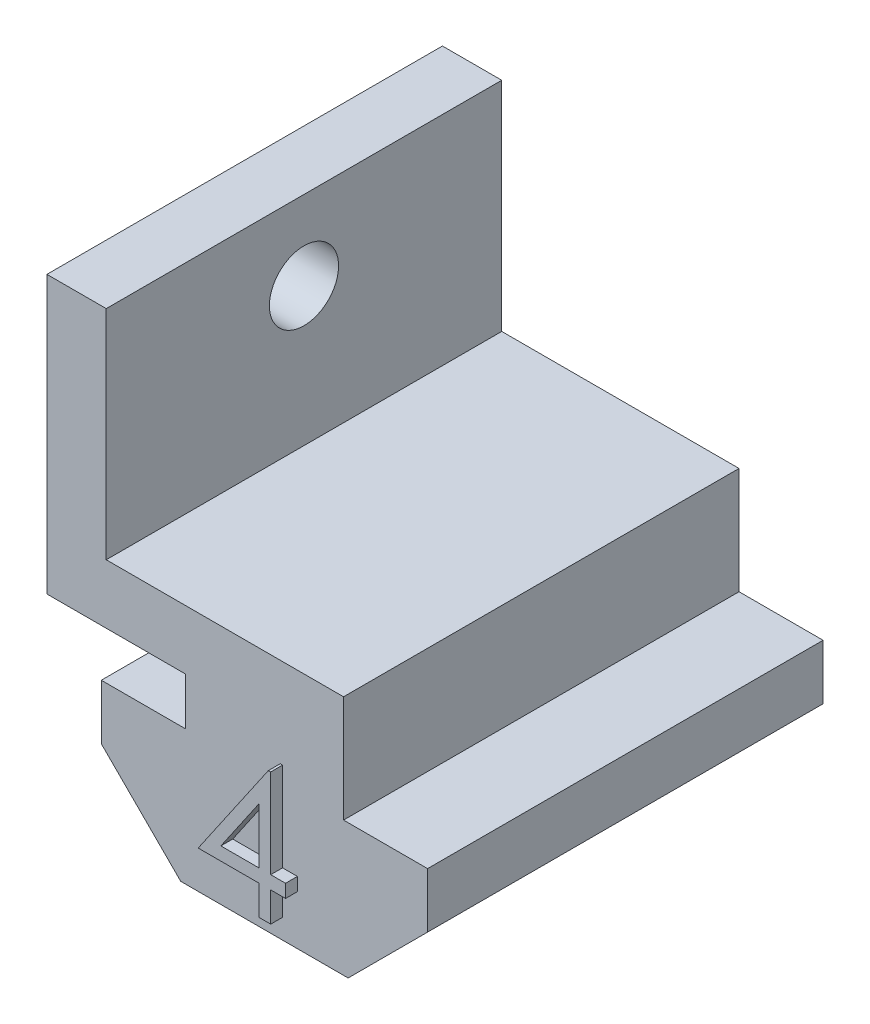
ISO-10303-21;
HEADER;
FILE_DESCRIPTION(('STEP AP214'),'2;1');
FILE_NAME('part.step','',(''),(''),'','','');
FILE_SCHEMA(('AUTOMOTIVE_DESIGN { 1 0 10303 214 1 1 1 1 }'));
ENDSEC;
DATA;
#1=APPLICATION_CONTEXT('core data for automotive mechanical design processes');
#2=APPLICATION_PROTOCOL_DEFINITION('international standard','automotive_design',2000,#1);
#3=PRODUCT_CONTEXT('',#1,'mechanical');
#4=PRODUCT('Part','Part','',(#3));
#5=PRODUCT_RELATED_PRODUCT_CATEGORY('part','',(#4));
#6=PRODUCT_DEFINITION_FORMATION('','',#4);
#7=PRODUCT_DEFINITION_CONTEXT('part definition',#1,'design');
#8=PRODUCT_DEFINITION('design','',#6,#7);
#9=PRODUCT_DEFINITION_SHAPE('','',#8);
#10=(LENGTH_UNIT() NAMED_UNIT(*) SI_UNIT(.MILLI.,.METRE.));
#11=(NAMED_UNIT(*) PLANE_ANGLE_UNIT() SI_UNIT($,.RADIAN.));
#12=(NAMED_UNIT(*) SI_UNIT($,.STERADIAN.) SOLID_ANGLE_UNIT());
#13=UNCERTAINTY_MEASURE_WITH_UNIT(LENGTH_MEASURE(1.E-05),#10,'distance_accuracy_value','');
#14=(GEOMETRIC_REPRESENTATION_CONTEXT(3) GLOBAL_UNCERTAINTY_ASSIGNED_CONTEXT((#13)) GLOBAL_UNIT_ASSIGNED_CONTEXT((#10,
#11,#12)) REPRESENTATION_CONTEXT('',''));
#15=CARTESIAN_POINT('',(0.,0.,0.));
#16=DIRECTION('',(0.,0.,1.));
#17=DIRECTION('',(1.,0.,0.));
#18=AXIS2_PLACEMENT_3D('',#15,#16,#17);
#19=CARTESIAN_POINT('',(0.,0.,0.));
#20=DIRECTION('',(0.,0.,-1.));
#21=DIRECTION('',(-1.,0.,0.));
#22=AXIS2_PLACEMENT_3D('',#19,#20,#21);
#23=PLANE('',#22);
#24=DIRECTION('',(-1.,0.,0.));
#25=VECTOR('',#24,1.);
#26=CARTESIAN_POINT('',(0.333333333333333,2.5,0.));
#27=LINE('',#26,#25);
#28=CARTESIAN_POINT('',(0.333333333333333,2.5,0.));
#29=VERTEX_POINT('',#28);
#30=CARTESIAN_POINT('',(-2.75,2.5,0.));
#31=VERTEX_POINT('',#30);
#32=EDGE_CURVE('E249',#29,#31,#27,.T.);
#33=ORIENTED_EDGE('',*,*,#32,.T.);
#34=DIRECTION('',(0.566105543193208,0.824332768950697,0.));
#35=VECTOR('',#34,1.);
#36=CARTESIAN_POINT('',(-2.75,2.5,0.));
#37=LINE('',#36,#35);
#38=CARTESIAN_POINT('',(0.798177083333333,7.66666666666667,0.));
#39=VERTEX_POINT('',#38);
#40=EDGE_CURVE('E230',#31,#39,#37,.T.);
#41=ORIENTED_EDGE('',*,*,#40,.T.);
#42=DIRECTION('',(1.,0.,0.));
#43=VECTOR('',#42,1.);
#44=CARTESIAN_POINT('',(0.798177083333333,7.66666666666667,0.));
#45=LINE('',#44,#43);
#46=CARTESIAN_POINT('',(0.916666666666666,7.66666666666667,0.));
#47=VERTEX_POINT('',#46);
#48=EDGE_CURVE('E279',#39,#47,#45,.T.);
#49=ORIENTED_EDGE('',*,*,#48,.T.);
#50=DIRECTION('',(0.,-1.,0.));
#51=VECTOR('',#50,1.);
#52=CARTESIAN_POINT('',(0.916666666666666,7.66666666666667,0.));
#53=LINE('',#52,#51);
#54=CARTESIAN_POINT('',(0.916666666666666,3.16666666666667,0.));
#55=VERTEX_POINT('',#54);
#56=EDGE_CURVE('E50',#47,#55,#53,.T.);
#57=ORIENTED_EDGE('',*,*,#56,.T.);
#58=DIRECTION('',(1.,0.,0.));
#59=VECTOR('',#58,1.);
#60=CARTESIAN_POINT('',(0.916666666666666,3.16666666666667,0.));
#61=LINE('',#60,#59);
#62=CARTESIAN_POINT('',(1.66666666666667,3.16666666666667,0.));
#63=VERTEX_POINT('',#62);
#64=EDGE_CURVE('E283',#55,#63,#61,.T.);
#65=ORIENTED_EDGE('',*,*,#64,.T.);
#66=DIRECTION('',(0.,-1.,0.));
#67=VECTOR('',#66,1.);
#68=CARTESIAN_POINT('',(1.66666666666667,3.16666666666667,0.));
#69=LINE('',#68,#67);
#70=CARTESIAN_POINT('',(1.66666666666667,2.5,0.));
#71=VERTEX_POINT('',#70);
#72=EDGE_CURVE('E286',#63,#71,#69,.T.);
#73=ORIENTED_EDGE('',*,*,#72,.T.);
#74=DIRECTION('',(-1.,0.,0.));
#75=VECTOR('',#74,1.);
#76=CARTESIAN_POINT('',(1.66666666666667,2.5,0.));
#77=LINE('',#76,#75);
#78=CARTESIAN_POINT('',(0.916666666666666,2.5,0.));
#79=VERTEX_POINT('',#78);
#80=EDGE_CURVE('E289',#71,#79,#77,.T.);
#81=ORIENTED_EDGE('',*,*,#80,.T.);
#82=DIRECTION('',(0.,-1.,0.));
#83=VECTOR('',#82,1.);
#84=CARTESIAN_POINT('',(0.916666666666666,2.5,0.));
#85=LINE('',#84,#83);
#86=CARTESIAN_POINT('',(0.916666666666666,1.,0.));
#87=VERTEX_POINT('',#86);
#88=EDGE_CURVE('E292',#79,#87,#85,.T.);
#89=ORIENTED_EDGE('',*,*,#88,.T.);
#90=DIRECTION('',(-1.,0.,0.));
#91=VECTOR('',#90,1.);
#92=CARTESIAN_POINT('',(0.916666666666666,1.,0.));
#93=LINE('',#92,#91);
#94=CARTESIAN_POINT('',(0.333333333333333,1.,0.));
#95=VERTEX_POINT('',#94);
#96=EDGE_CURVE('E295',#87,#95,#93,.T.);
#97=ORIENTED_EDGE('',*,*,#96,.T.);
#98=DIRECTION('',(0.,1.,0.));
#99=VECTOR('',#98,1.);
#100=CARTESIAN_POINT('',(0.333333333333333,1.,0.));
#101=LINE('',#100,#99);
#102=EDGE_CURVE('E298',#95,#29,#101,.T.);
#103=ORIENTED_EDGE('',*,*,#102,.T.);
#104=EDGE_LOOP('',(#33,#41,#49,#57,#65,#73,#81,#89,#97,#103));
#105=FACE_BOUND('',#104,.T.);
#106=DIRECTION('',(-1.,0.,0.));
#107=VECTOR('',#106,1.);
#108=CARTESIAN_POINT('',(-8.,12.2,0.));
#109=LINE('',#108,#107);
#110=CARTESIAN_POINT('',(4.00000000000456,12.2,0.));
#111=VERTEX_POINT('',#110);
#112=CARTESIAN_POINT('',(-8.,12.2,0.));
#113=VERTEX_POINT('',#112);
#114=EDGE_CURVE('E326',#111,#113,#109,.T.);
#115=ORIENTED_EDGE('',*,*,#114,.T.);
#116=DIRECTION('',(0.,1.,0.));
#117=VECTOR('',#116,1.);
#118=CARTESIAN_POINT('',(-8.,23.2,0.));
#119=LINE('',#118,#117);
#120=CARTESIAN_POINT('',(-8.,23.2,0.));
#121=VERTEX_POINT('',#120);
#122=EDGE_CURVE('E373',#113,#121,#119,.T.);
#123=ORIENTED_EDGE('',*,*,#122,.T.);
#124=DIRECTION('',(-1.,0.,0.));
#125=VECTOR('',#124,1.);
#126=CARTESIAN_POINT('',(-11.,23.2,0.));
#127=LINE('',#126,#125);
#128=CARTESIAN_POINT('',(-11.,23.2,0.));
#129=VERTEX_POINT('',#128);
#130=EDGE_CURVE('E376',#121,#129,#127,.T.);
#131=ORIENTED_EDGE('',*,*,#130,.T.);
#132=DIRECTION('',(0.,-1.,0.));
#133=VECTOR('',#132,1.);
#134=CARTESIAN_POINT('',(-11.,9.2,0.));
#135=LINE('',#134,#133);
#136=CARTESIAN_POINT('',(-11.,9.2,0.));
#137=VERTEX_POINT('',#136);
#138=EDGE_CURVE('E379',#129,#137,#135,.T.);
#139=ORIENTED_EDGE('',*,*,#138,.T.);
#140=DIRECTION('',(1.,0.,0.));
#141=VECTOR('',#140,1.);
#142=CARTESIAN_POINT('',(-4.00000000000456,9.2,0.));
#143=LINE('',#142,#141);
#144=CARTESIAN_POINT('',(-4.00000000000456,9.2,0.));
#145=VERTEX_POINT('',#144);
#146=EDGE_CURVE('E382',#137,#145,#143,.T.);
#147=ORIENTED_EDGE('',*,*,#146,.T.);
#148=DIRECTION('',(0.,-1.,0.));
#149=VECTOR('',#148,1.);
#150=CARTESIAN_POINT('',(-4.00000000000456,9.2,0.));
#151=LINE('',#150,#149);
#152=CARTESIAN_POINT('',(-4.00000000000454,6.8,0.));
#153=VERTEX_POINT('',#152);
#154=EDGE_CURVE('E385',#145,#153,#151,.T.);
#155=ORIENTED_EDGE('',*,*,#154,.T.);
#156=DIRECTION('',(-1.,0.,0.));
#157=VECTOR('',#156,1.);
#158=CARTESIAN_POINT('',(-4.00000000000454,6.8,0.));
#159=LINE('',#158,#157);
#160=CARTESIAN_POINT('',(-8.25000000000231,6.8,0.));
#161=VERTEX_POINT('',#160);
#162=EDGE_CURVE('E388',#153,#161,#159,.T.);
#163=ORIENTED_EDGE('',*,*,#162,.T.);
#164=DIRECTION('',(0.,-1.,0.));
#165=VECTOR('',#164,1.);
#166=CARTESIAN_POINT('',(-8.25000000000231,6.8,0.));
#167=LINE('',#166,#165);
#168=CARTESIAN_POINT('',(-8.25000000000227,4.01776695296648,0.));
#169=VERTEX_POINT('',#168);
#170=EDGE_CURVE('E391',#161,#169,#167,.T.);
#171=ORIENTED_EDGE('',*,*,#170,.T.);
#172=DIRECTION('',(0.707106781186544,-0.707106781186551,0.));
#173=VECTOR('',#172,1.);
#174=CARTESIAN_POINT('',(-8.25000000000227,4.01776695296648,0.));
#175=LINE('',#174,#173);
#176=CARTESIAN_POINT('',(-4.23223304703582,0.,0.));
#177=VERTEX_POINT('',#176);
#178=EDGE_CURVE('E394',#169,#177,#175,.T.);
#179=ORIENTED_EDGE('',*,*,#178,.T.);
#180=DIRECTION('',(1.,0.,0.));
#181=VECTOR('',#180,1.);
#182=CARTESIAN_POINT('',(-4.23223304703582,0.,0.));
#183=LINE('',#182,#181);
#184=CARTESIAN_POINT('',(4.23223304703582,0.,0.));
#185=VERTEX_POINT('',#184);
#186=EDGE_CURVE('E397',#177,#185,#183,.T.);
#187=ORIENTED_EDGE('',*,*,#186,.T.);
#188=DIRECTION('',(0.707106781186548,0.707106781186548,0.));
#189=VECTOR('',#188,1.);
#190=CARTESIAN_POINT('',(8.25000000000231,4.01776695296648,0.));
#191=LINE('',#190,#189);
#192=CARTESIAN_POINT('',(8.25000000000231,4.01776695296648,0.));
#193=VERTEX_POINT('',#192);
#194=EDGE_CURVE('E400',#185,#193,#191,.T.);
#195=ORIENTED_EDGE('',*,*,#194,.T.);
#196=DIRECTION('',(0.,1.,0.));
#197=VECTOR('',#196,1.);
#198=CARTESIAN_POINT('',(8.25000000000231,6.8,0.));
#199=LINE('',#198,#197);
#200=CARTESIAN_POINT('',(8.25000000000231,6.8,0.));
#201=VERTEX_POINT('',#200);
#202=EDGE_CURVE('E403',#193,#201,#199,.T.);
#203=ORIENTED_EDGE('',*,*,#202,.T.);
#204=DIRECTION('',(-1.,0.,0.));
#205=VECTOR('',#204,1.);
#206=CARTESIAN_POINT('',(4.00000000000461,6.8,0.));
#207=LINE('',#206,#205);
#208=CARTESIAN_POINT('',(4.00000000000461,6.8,0.));
#209=VERTEX_POINT('',#208);
#210=EDGE_CURVE('E406',#201,#209,#207,.T.);
#211=ORIENTED_EDGE('',*,*,#210,.T.);
#212=DIRECTION('',(0.,1.,0.));
#213=VECTOR('',#212,1.);
#214=CARTESIAN_POINT('',(4.00000000000456,12.2,0.));
#215=LINE('',#214,#213);
#216=EDGE_CURVE('E333',#209,#111,#215,.T.);
#217=ORIENTED_EDGE('',*,*,#216,.T.);
#218=EDGE_LOOP('',(#115,#123,#131,#139,#147,#155,#163,#171,#179,#187,#195,#203,#211,#217));
#219=FACE_BOUND('',#218,.T.);
#220=ADVANCED_FACE('F33',(#105,#219),#23,.F.);
#221=CARTESIAN_POINT('',(-8.,12.2,-20.));
#222=DIRECTION('',(0.,1.,0.));
#223=DIRECTION('',(0.,0.,1.));
#224=AXIS2_PLACEMENT_3D('',#221,#222,#223);
#225=PLANE('',#224);
#226=ORIENTED_EDGE('',*,*,#114,.F.);
#227=DIRECTION('',(0.,0.,1.));
#228=VECTOR('',#227,1.);
#229=CARTESIAN_POINT('',(4.00000000000456,12.2,-20.));
#230=LINE('',#229,#228);
#231=CARTESIAN_POINT('',(4.00000000000456,12.2,-20.));
#232=VERTEX_POINT('',#231);
#233=EDGE_CURVE('E11',#232,#111,#230,.T.);
#234=ORIENTED_EDGE('',*,*,#233,.F.);
#235=DIRECTION('',(-1.,0.,0.));
#236=VECTOR('',#235,1.);
#237=CARTESIAN_POINT('',(-8.,12.2,-20.));
#238=LINE('',#237,#236);
#239=CARTESIAN_POINT('',(-8.,12.2,-20.));
#240=VERTEX_POINT('',#239);
#241=EDGE_CURVE('E329',#232,#240,#238,.T.);
#242=ORIENTED_EDGE('',*,*,#241,.T.);
#243=DIRECTION('',(0.,0.,1.));
#244=VECTOR('',#243,1.);
#245=CARTESIAN_POINT('',(-8.,12.2,-20.));
#246=LINE('',#245,#244);
#247=EDGE_CURVE('E37',#240,#113,#246,.T.);
#248=ORIENTED_EDGE('',*,*,#247,.T.);
#249=EDGE_LOOP('',(#226,#234,#242,#248));
#250=FACE_BOUND('',#249,.T.);
#251=ADVANCED_FACE('F35',(#250),#225,.T.);
#252=CARTESIAN_POINT('',(4.00000000000456,12.2,-20.));
#253=DIRECTION('',(1.,0.,0.));
#254=DIRECTION('',(0.,1.,0.));
#255=AXIS2_PLACEMENT_3D('',#252,#253,#254);
#256=PLANE('',#255);
#257=ORIENTED_EDGE('',*,*,#216,.F.);
#258=DIRECTION('',(0.,0.,1.));
#259=VECTOR('',#258,1.);
#260=CARTESIAN_POINT('',(4.00000000000461,6.8,-20.));
#261=LINE('',#260,#259);
#262=CARTESIAN_POINT('',(4.00000000000461,6.8,-20.));
#263=VERTEX_POINT('',#262);
#264=EDGE_CURVE('E42',#263,#209,#261,.T.);
#265=ORIENTED_EDGE('',*,*,#264,.F.);
#266=DIRECTION('',(0.,1.,0.));
#267=VECTOR('',#266,1.);
#268=CARTESIAN_POINT('',(4.00000000000456,9.2,-20.));
#269=LINE('',#268,#267);
#270=EDGE_CURVE('E369',#263,#232,#269,.T.);
#271=ORIENTED_EDGE('',*,*,#270,.T.);
#272=ORIENTED_EDGE('',*,*,#233,.T.);
#273=EDGE_LOOP('',(#257,#265,#271,#272));
#274=FACE_BOUND('',#273,.T.);
#275=ADVANCED_FACE('F445',(#274),#256,.T.);
#276=CARTESIAN_POINT('',(4.00000000000461,6.8,-20.));
#277=DIRECTION('',(0.,1.,0.));
#278=DIRECTION('',(0.,0.,1.));
#279=AXIS2_PLACEMENT_3D('',#276,#277,#278);
#280=PLANE('',#279);
#281=ORIENTED_EDGE('',*,*,#210,.F.);
#282=DIRECTION('',(0.,0.,1.));
#283=VECTOR('',#282,1.);
#284=CARTESIAN_POINT('',(8.25000000000231,6.8,-20.));
#285=LINE('',#284,#283);
#286=CARTESIAN_POINT('',(8.25000000000231,6.8,-20.));
#287=VERTEX_POINT('',#286);
#288=EDGE_CURVE('E413',#287,#201,#285,.T.);
#289=ORIENTED_EDGE('',*,*,#288,.F.);
#290=DIRECTION('',(-1.,0.,0.));
#291=VECTOR('',#290,1.);
#292=CARTESIAN_POINT('',(4.00000000000461,6.8,-20.));
#293=LINE('',#292,#291);
#294=EDGE_CURVE('E366',#287,#263,#293,.T.);
#295=ORIENTED_EDGE('',*,*,#294,.T.);
#296=ORIENTED_EDGE('',*,*,#264,.T.);
#297=EDGE_LOOP('',(#281,#289,#295,#296));
#298=FACE_BOUND('',#297,.T.);
#299=ADVANCED_FACE('F448',(#298),#280,.T.);
#300=CARTESIAN_POINT('',(8.25000000000231,6.8,-20.));
#301=DIRECTION('',(1.,0.,0.));
#302=DIRECTION('',(0.,0.,-1.));
#303=AXIS2_PLACEMENT_3D('',#300,#301,#302);
#304=PLANE('',#303);
#305=ORIENTED_EDGE('',*,*,#202,.F.);
#306=DIRECTION('',(0.,0.,1.));
#307=VECTOR('',#306,1.);
#308=CARTESIAN_POINT('',(8.25000000000231,4.01776695296648,-20.));
#309=LINE('',#308,#307);
#310=CARTESIAN_POINT('',(8.25000000000231,4.01776695296648,-20.));
#311=VERTEX_POINT('',#310);
#312=EDGE_CURVE('E415',#311,#193,#309,.T.);
#313=ORIENTED_EDGE('',*,*,#312,.F.);
#314=DIRECTION('',(0.,1.,0.));
#315=VECTOR('',#314,1.);
#316=CARTESIAN_POINT('',(8.25000000000231,6.8,-20.));
#317=LINE('',#316,#315);
#318=EDGE_CURVE('E363',#311,#287,#317,.T.);
#319=ORIENTED_EDGE('',*,*,#318,.T.);
#320=ORIENTED_EDGE('',*,*,#288,.T.);
#321=EDGE_LOOP('',(#305,#313,#319,#320));
#322=FACE_BOUND('',#321,.T.);
#323=ADVANCED_FACE('F456',(#322),#304,.T.);
#324=CARTESIAN_POINT('',(8.25000000000231,4.01776695296648,-20.));
#325=DIRECTION('',(0.707106781186548,-0.707106781186548,0.));
#326=DIRECTION('',(0.707106781186548,0.707106781186548,0.));
#327=AXIS2_PLACEMENT_3D('',#324,#325,#326);
#328=PLANE('',#327);
#329=ORIENTED_EDGE('',*,*,#194,.F.);
#330=DIRECTION('',(0.,0.,1.));
#331=VECTOR('',#330,1.);
#332=CARTESIAN_POINT('',(4.23223304703582,0.,-20.));
#333=LINE('',#332,#331);
#334=CARTESIAN_POINT('',(4.23223304703582,0.,-20.));
#335=VERTEX_POINT('',#334);
#336=EDGE_CURVE('E417',#335,#185,#333,.T.);
#337=ORIENTED_EDGE('',*,*,#336,.F.);
#338=DIRECTION('',(0.707106781186548,0.707106781186548,0.));
#339=VECTOR('',#338,1.);
#340=CARTESIAN_POINT('',(8.25000000000231,4.01776695296648,-20.));
#341=LINE('',#340,#339);
#342=EDGE_CURVE('E360',#335,#311,#341,.T.);
#343=ORIENTED_EDGE('',*,*,#342,.T.);
#344=ORIENTED_EDGE('',*,*,#312,.T.);
#345=EDGE_LOOP('',(#329,#337,#343,#344));
#346=FACE_BOUND('',#345,.T.);
#347=ADVANCED_FACE('F459',(#346),#328,.T.);
#348=CARTESIAN_POINT('',(-4.23223304703582,0.,-20.));
#349=DIRECTION('',(0.,-1.,0.));
#350=DIRECTION('',(1.,0.,0.));
#351=AXIS2_PLACEMENT_3D('',#348,#349,#350);
#352=PLANE('',#351);
#353=ORIENTED_EDGE('',*,*,#186,.F.);
#354=DIRECTION('',(0.,0.,1.));
#355=VECTOR('',#354,1.);
#356=CARTESIAN_POINT('',(-4.23223304703582,0.,-20.));
#357=LINE('',#356,#355);
#358=CARTESIAN_POINT('',(-4.23223304703582,0.,-20.));
#359=VERTEX_POINT('',#358);
#360=EDGE_CURVE('E419',#359,#177,#357,.T.);
#361=ORIENTED_EDGE('',*,*,#360,.F.);
#362=DIRECTION('',(1.,0.,0.));
#363=VECTOR('',#362,1.);
#364=CARTESIAN_POINT('',(-4.23223304703582,0.,-20.));
#365=LINE('',#364,#363);
#366=EDGE_CURVE('E357',#359,#335,#365,.T.);
#367=ORIENTED_EDGE('',*,*,#366,.T.);
#368=ORIENTED_EDGE('',*,*,#336,.T.);
#369=EDGE_LOOP('',(#353,#361,#367,#368));
#370=FACE_BOUND('',#369,.T.);
#371=ADVANCED_FACE('F464',(#370),#352,.T.);
#372=CARTESIAN_POINT('',(-8.25000000000227,4.01776695296648,-20.));
#373=DIRECTION('',(-0.707106781186551,-0.707106781186544,0.));
#374=DIRECTION('',(0.707106781186544,-0.707106781186551,0.));
#375=AXIS2_PLACEMENT_3D('',#372,#373,#374);
#376=PLANE('',#375);
#377=ORIENTED_EDGE('',*,*,#178,.F.);
#378=DIRECTION('',(0.,0.,1.));
#379=VECTOR('',#378,1.);
#380=CARTESIAN_POINT('',(-8.25000000000227,4.01776695296648,-20.));
#381=LINE('',#380,#379);
#382=CARTESIAN_POINT('',(-8.25000000000227,4.01776695296648,-20.));
#383=VERTEX_POINT('',#382);
#384=EDGE_CURVE('E421',#383,#169,#381,.T.);
#385=ORIENTED_EDGE('',*,*,#384,.F.);
#386=DIRECTION('',(0.707106781186544,-0.707106781186551,0.));
#387=VECTOR('',#386,1.);
#388=CARTESIAN_POINT('',(-8.25000000000227,4.01776695296648,-20.));
#389=LINE('',#388,#387);
#390=EDGE_CURVE('E354',#383,#359,#389,.T.);
#391=ORIENTED_EDGE('',*,*,#390,.T.);
#392=ORIENTED_EDGE('',*,*,#360,.T.);
#393=EDGE_LOOP('',(#377,#385,#391,#392));
#394=FACE_BOUND('',#393,.T.);
#395=ADVANCED_FACE('F467',(#394),#376,.T.);
#396=CARTESIAN_POINT('',(-8.25000000000231,6.8,-20.));
#397=DIRECTION('',(-1.,0.,0.));
#398=DIRECTION('',(0.,-1.,0.));
#399=AXIS2_PLACEMENT_3D('',#396,#397,#398);
#400=PLANE('',#399);
#401=ORIENTED_EDGE('',*,*,#170,.F.);
#402=DIRECTION('',(0.,0.,1.));
#403=VECTOR('',#402,1.);
#404=CARTESIAN_POINT('',(-8.25000000000231,6.8,-20.));
#405=LINE('',#404,#403);
#406=CARTESIAN_POINT('',(-8.25000000000231,6.8,-20.));
#407=VERTEX_POINT('',#406);
#408=EDGE_CURVE('E423',#407,#161,#405,.T.);
#409=ORIENTED_EDGE('',*,*,#408,.F.);
#410=DIRECTION('',(0.,-1.,0.));
#411=VECTOR('',#410,1.);
#412=CARTESIAN_POINT('',(-8.25000000000231,6.8,-20.));
#413=LINE('',#412,#411);
#414=EDGE_CURVE('E351',#407,#383,#413,.T.);
#415=ORIENTED_EDGE('',*,*,#414,.T.);
#416=ORIENTED_EDGE('',*,*,#384,.T.);
#417=EDGE_LOOP('',(#401,#409,#415,#416));
#418=FACE_BOUND('',#417,.T.);
#419=ADVANCED_FACE('F472',(#418),#400,.T.);
#420=CARTESIAN_POINT('',(-4.00000000000454,6.8,-20.));
#421=DIRECTION('',(0.,1.,0.));
#422=DIRECTION('',(0.,0.,1.));
#423=AXIS2_PLACEMENT_3D('',#420,#421,#422);
#424=PLANE('',#423);
#425=ORIENTED_EDGE('',*,*,#162,.F.);
#426=DIRECTION('',(0.,0.,1.));
#427=VECTOR('',#426,1.);
#428=CARTESIAN_POINT('',(-4.00000000000454,6.8,-20.));
#429=LINE('',#428,#427);
#430=CARTESIAN_POINT('',(-4.00000000000454,6.8,-20.));
#431=VERTEX_POINT('',#430);
#432=EDGE_CURVE('E425',#431,#153,#429,.T.);
#433=ORIENTED_EDGE('',*,*,#432,.F.);
#434=DIRECTION('',(-1.,0.,0.));
#435=VECTOR('',#434,1.);
#436=CARTESIAN_POINT('',(-4.00000000000454,6.8,-20.));
#437=LINE('',#436,#435);
#438=EDGE_CURVE('E348',#431,#407,#437,.T.);
#439=ORIENTED_EDGE('',*,*,#438,.T.);
#440=ORIENTED_EDGE('',*,*,#408,.T.);
#441=EDGE_LOOP('',(#425,#433,#439,#440));
#442=FACE_BOUND('',#441,.T.);
#443=ADVANCED_FACE('F475',(#442),#424,.T.);
#444=CARTESIAN_POINT('',(-4.00000000000456,9.2,-20.));
#445=DIRECTION('',(-1.,0.,0.));
#446=DIRECTION('',(0.,-1.,0.));
#447=AXIS2_PLACEMENT_3D('',#444,#445,#446);
#448=PLANE('',#447);
#449=ORIENTED_EDGE('',*,*,#154,.F.);
#450=DIRECTION('',(0.,0.,1.));
#451=VECTOR('',#450,1.);
#452=CARTESIAN_POINT('',(-4.00000000000456,9.2,-20.));
#453=LINE('',#452,#451);
#454=CARTESIAN_POINT('',(-4.00000000000456,9.2,-20.));
#455=VERTEX_POINT('',#454);
#456=EDGE_CURVE('E427',#455,#145,#453,.T.);
#457=ORIENTED_EDGE('',*,*,#456,.F.);
#458=DIRECTION('',(0.,-1.,0.));
#459=VECTOR('',#458,1.);
#460=CARTESIAN_POINT('',(-4.00000000000456,9.2,-20.));
#461=LINE('',#460,#459);
#462=EDGE_CURVE('E345',#455,#431,#461,.T.);
#463=ORIENTED_EDGE('',*,*,#462,.T.);
#464=ORIENTED_EDGE('',*,*,#432,.T.);
#465=EDGE_LOOP('',(#449,#457,#463,#464));
#466=FACE_BOUND('',#465,.T.);
#467=ADVANCED_FACE('F480',(#466),#448,.T.);
#468=CARTESIAN_POINT('',(-4.00000000000456,9.2,-20.));
#469=DIRECTION('',(0.,-1.,0.));
#470=DIRECTION('',(0.,0.,-1.));
#471=AXIS2_PLACEMENT_3D('',#468,#469,#470);
#472=PLANE('',#471);
#473=ORIENTED_EDGE('',*,*,#146,.F.);
#474=DIRECTION('',(0.,0.,1.));
#475=VECTOR('',#474,1.);
#476=CARTESIAN_POINT('',(-11.,9.2,-20.));
#477=LINE('',#476,#475);
#478=CARTESIAN_POINT('',(-11.,9.2,-20.));
#479=VERTEX_POINT('',#478);
#480=EDGE_CURVE('E429',#479,#137,#477,.T.);
#481=ORIENTED_EDGE('',*,*,#480,.F.);
#482=DIRECTION('',(1.,0.,0.));
#483=VECTOR('',#482,1.);
#484=CARTESIAN_POINT('',(-4.00000000000456,9.2,-20.));
#485=LINE('',#484,#483);
#486=EDGE_CURVE('E342',#479,#455,#485,.T.);
#487=ORIENTED_EDGE('',*,*,#486,.T.);
#488=ORIENTED_EDGE('',*,*,#456,.T.);
#489=EDGE_LOOP('',(#473,#481,#487,#488));
#490=FACE_BOUND('',#489,.T.);
#491=ADVANCED_FACE('F483',(#490),#472,.T.);
#492=CARTESIAN_POINT('',(-11.,9.2,-20.));
#493=DIRECTION('',(-1.,0.,0.));
#494=DIRECTION('',(0.,0.,1.));
#495=AXIS2_PLACEMENT_3D('',#492,#493,#494);
#496=PLANE('',#495);
#497=CARTESIAN_POINT('',(-11.,19.2,-10.));
#498=DIRECTION('',(-1.,0.,0.));
#499=DIRECTION('',(0.,0.,1.));
#500=AXIS2_PLACEMENT_3D('',#497,#498,#499);
#501=CIRCLE('',#500,1.75);
#502=CARTESIAN_POINT('',(-11.,19.2,-8.25));
#503=VERTEX_POINT('',#502);
#504=EDGE_CURVE('E323',#503,#503,#501,.T.);
#505=ORIENTED_EDGE('',*,*,#504,.F.);
#506=EDGE_LOOP('',(#505));
#507=FACE_BOUND('',#506,.T.);
#508=ORIENTED_EDGE('',*,*,#138,.F.);
#509=DIRECTION('',(0.,0.,1.));
#510=VECTOR('',#509,1.);
#511=CARTESIAN_POINT('',(-11.,23.2,-20.));
#512=LINE('',#511,#510);
#513=CARTESIAN_POINT('',(-11.,23.2,-20.));
#514=VERTEX_POINT('',#513);
#515=EDGE_CURVE('E431',#514,#129,#512,.T.);
#516=ORIENTED_EDGE('',*,*,#515,.F.);
#517=DIRECTION('',(0.,-1.,0.));
#518=VECTOR('',#517,1.);
#519=CARTESIAN_POINT('',(-11.,9.2,-20.));
#520=LINE('',#519,#518);
#521=EDGE_CURVE('E339',#514,#479,#520,.T.);
#522=ORIENTED_EDGE('',*,*,#521,.T.);
#523=ORIENTED_EDGE('',*,*,#480,.T.);
#524=EDGE_LOOP('',(#508,#516,#522,#523));
#525=FACE_BOUND('',#524,.T.);
#526=ADVANCED_FACE('F488',(#507,#525),#496,.T.);
#527=CARTESIAN_POINT('',(-11.,23.2,-20.));
#528=DIRECTION('',(0.,1.,0.));
#529=DIRECTION('',(0.,0.,1.));
#530=AXIS2_PLACEMENT_3D('',#527,#528,#529);
#531=PLANE('',#530);
#532=ORIENTED_EDGE('',*,*,#130,.F.);
#533=DIRECTION('',(0.,0.,1.));
#534=VECTOR('',#533,1.);
#535=CARTESIAN_POINT('',(-8.,23.2,-20.));
#536=LINE('',#535,#534);
#537=CARTESIAN_POINT('',(-8.,23.2,-20.));
#538=VERTEX_POINT('',#537);
#539=EDGE_CURVE('E432',#538,#121,#536,.T.);
#540=ORIENTED_EDGE('',*,*,#539,.F.);
#541=DIRECTION('',(-1.,0.,0.));
#542=VECTOR('',#541,1.);
#543=CARTESIAN_POINT('',(-11.,23.2,-20.));
#544=LINE('',#543,#542);
#545=EDGE_CURVE('E336',#538,#514,#544,.T.);
#546=ORIENTED_EDGE('',*,*,#545,.T.);
#547=ORIENTED_EDGE('',*,*,#515,.T.);
#548=EDGE_LOOP('',(#532,#540,#546,#547));
#549=FACE_BOUND('',#548,.T.);
#550=ADVANCED_FACE('F490',(#549),#531,.T.);
#551=CARTESIAN_POINT('',(-8.,23.2,-20.));
#552=DIRECTION('',(1.,0.,0.));
#553=DIRECTION('',(0.,1.,0.));
#554=AXIS2_PLACEMENT_3D('',#551,#552,#553);
#555=PLANE('',#554);
#556=CARTESIAN_POINT('',(-8.,19.2,-10.));
#557=DIRECTION('',(1.,0.,0.));
#558=DIRECTION('',(0.,1.,0.));
#559=AXIS2_PLACEMENT_3D('',#556,#557,#558);
#560=CIRCLE('',#559,1.75);
#561=CARTESIAN_POINT('',(-8.,20.95,-10.));
#562=VERTEX_POINT('',#561);
#563=EDGE_CURVE('E305',#562,#562,#560,.F.);
#564=ORIENTED_EDGE('',*,*,#563,.T.);
#565=EDGE_LOOP('',(#564));
#566=FACE_BOUND('',#565,.T.);
#567=ORIENTED_EDGE('',*,*,#122,.F.);
#568=ORIENTED_EDGE('',*,*,#247,.F.);
#569=DIRECTION('',(0.,1.,0.));
#570=VECTOR('',#569,1.);
#571=CARTESIAN_POINT('',(-8.,23.2,-20.));
#572=LINE('',#571,#570);
#573=EDGE_CURVE('E332',#240,#538,#572,.T.);
#574=ORIENTED_EDGE('',*,*,#573,.T.);
#575=ORIENTED_EDGE('',*,*,#539,.T.);
#576=EDGE_LOOP('',(#567,#568,#574,#575));
#577=FACE_BOUND('',#576,.T.);
#578=ADVANCED_FACE('F441',(#566,#577),#555,.T.);
#579=CARTESIAN_POINT('',(0.,0.,-20.));
#580=DIRECTION('',(0.,0.,-1.));
#581=DIRECTION('',(-1.,0.,0.));
#582=AXIS2_PLACEMENT_3D('',#579,#580,#581);
#583=PLANE('',#582);
#584=ORIENTED_EDGE('',*,*,#241,.F.);
#585=ORIENTED_EDGE('',*,*,#270,.F.);
#586=ORIENTED_EDGE('',*,*,#294,.F.);
#587=ORIENTED_EDGE('',*,*,#318,.F.);
#588=ORIENTED_EDGE('',*,*,#342,.F.);
#589=ORIENTED_EDGE('',*,*,#366,.F.);
#590=ORIENTED_EDGE('',*,*,#390,.F.);
#591=ORIENTED_EDGE('',*,*,#414,.F.);
#592=ORIENTED_EDGE('',*,*,#438,.F.);
#593=ORIENTED_EDGE('',*,*,#462,.F.);
#594=ORIENTED_EDGE('',*,*,#486,.F.);
#595=ORIENTED_EDGE('',*,*,#521,.F.);
#596=ORIENTED_EDGE('',*,*,#545,.F.);
#597=ORIENTED_EDGE('',*,*,#573,.F.);
#598=EDGE_LOOP('',(#584,#585,#586,#587,#588,#589,#590,#591,#592,#593,#594,#595,#596,#597));
#599=FACE_BOUND('',#598,.T.);
#600=ADVANCED_FACE('F452',(#599),#583,.T.);
#601=CARTESIAN_POINT('',(8.25100000000231,19.2,-10.));
#602=DIRECTION('',(-1.,0.,0.));
#603=DIRECTION('',(0.,0.,1.));
#604=AXIS2_PLACEMENT_3D('',#601,#602,#603);
#605=CYLINDRICAL_SURFACE('',#604,1.75);
#606=ORIENTED_EDGE('',*,*,#563,.F.);
#607=EDGE_LOOP('',(#606));
#608=FACE_BOUND('',#607,.T.);
#609=ORIENTED_EDGE('',*,*,#504,.T.);
#610=EDGE_LOOP('',(#609));
#611=FACE_BOUND('',#610,.T.);
#612=ADVANCED_FACE('F527',(#608,#611),#605,.F.);
#613=CARTESIAN_POINT('',(0.,0.,0.6));
#614=DIRECTION('',(0.,0.,-1.));
#615=DIRECTION('',(-1.,0.,0.));
#616=AXIS2_PLACEMENT_3D('',#613,#614,#615);
#617=PLANE('',#616);
#618=DIRECTION('',(0.566105543193208,0.824332768950697,0.));
#619=VECTOR('',#618,1.);
#620=CARTESIAN_POINT('',(-2.75,2.5,0.6));
#621=LINE('',#620,#619);
#622=CARTESIAN_POINT('',(-2.75,2.5,0.6));
#623=VERTEX_POINT('',#622);
#624=CARTESIAN_POINT('',(0.798177083333333,7.66666666666667,0.6));
#625=VERTEX_POINT('',#624);
#626=EDGE_CURVE('E245',#623,#625,#621,.T.);
#627=ORIENTED_EDGE('',*,*,#626,.F.);
#628=DIRECTION('',(-1.,0.,0.));
#629=VECTOR('',#628,1.);
#630=CARTESIAN_POINT('',(0.333333333333333,2.5,0.6));
#631=LINE('',#630,#629);
#632=CARTESIAN_POINT('',(0.333333333333333,2.5,0.6));
#633=VERTEX_POINT('',#632);
#634=EDGE_CURVE('E273',#633,#623,#631,.T.);
#635=ORIENTED_EDGE('',*,*,#634,.F.);
#636=DIRECTION('',(0.,1.,0.));
#637=VECTOR('',#636,1.);
#638=CARTESIAN_POINT('',(0.333333333333333,1.,0.6));
#639=LINE('',#638,#637);
#640=CARTESIAN_POINT('',(0.333333333333333,1.,0.6));
#641=VERTEX_POINT('',#640);
#642=EDGE_CURVE('E270',#641,#633,#639,.T.);
#643=ORIENTED_EDGE('',*,*,#642,.F.);
#644=DIRECTION('',(-1.,0.,0.));
#645=VECTOR('',#644,1.);
#646=CARTESIAN_POINT('',(0.916666666666666,1.,0.6));
#647=LINE('',#646,#645);
#648=CARTESIAN_POINT('',(0.916666666666666,1.,0.6));
#649=VERTEX_POINT('',#648);
#650=EDGE_CURVE('E267',#649,#641,#647,.T.);
#651=ORIENTED_EDGE('',*,*,#650,.F.);
#652=DIRECTION('',(0.,-1.,0.));
#653=VECTOR('',#652,1.);
#654=CARTESIAN_POINT('',(0.916666666666666,2.5,0.6));
#655=LINE('',#654,#653);
#656=CARTESIAN_POINT('',(0.916666666666666,2.5,0.6));
#657=VERTEX_POINT('',#656);
#658=EDGE_CURVE('E264',#657,#649,#655,.T.);
#659=ORIENTED_EDGE('',*,*,#658,.F.);
#660=DIRECTION('',(-1.,0.,0.));
#661=VECTOR('',#660,1.);
#662=CARTESIAN_POINT('',(1.66666666666667,2.5,0.6));
#663=LINE('',#662,#661);
#664=CARTESIAN_POINT('',(1.66666666666667,2.5,0.6));
#665=VERTEX_POINT('',#664);
#666=EDGE_CURVE('E261',#665,#657,#663,.T.);
#667=ORIENTED_EDGE('',*,*,#666,.F.);
#668=DIRECTION('',(0.,-1.,0.));
#669=VECTOR('',#668,1.);
#670=CARTESIAN_POINT('',(1.66666666666667,3.16666666666667,0.6));
#671=LINE('',#670,#669);
#672=CARTESIAN_POINT('',(1.66666666666667,3.16666666666667,0.6));
#673=VERTEX_POINT('',#672);
#674=EDGE_CURVE('E258',#673,#665,#671,.T.);
#675=ORIENTED_EDGE('',*,*,#674,.F.);
#676=DIRECTION('',(1.,0.,0.));
#677=VECTOR('',#676,1.);
#678=CARTESIAN_POINT('',(0.916666666666666,3.16666666666667,0.6));
#679=LINE('',#678,#677);
#680=CARTESIAN_POINT('',(0.916666666666666,3.16666666666667,0.6));
#681=VERTEX_POINT('',#680);
#682=EDGE_CURVE('E255',#681,#673,#679,.T.);
#683=ORIENTED_EDGE('',*,*,#682,.F.);
#684=DIRECTION('',(0.,-1.,0.));
#685=VECTOR('',#684,1.);
#686=CARTESIAN_POINT('',(0.916666666666666,7.66666666666667,0.6));
#687=LINE('',#686,#685);
#688=CARTESIAN_POINT('',(0.916666666666666,7.66666666666667,0.6));
#689=VERTEX_POINT('',#688);
#690=EDGE_CURVE('E252',#689,#681,#687,.T.);
#691=ORIENTED_EDGE('',*,*,#690,.F.);
#692=DIRECTION('',(1.,0.,0.));
#693=VECTOR('',#692,1.);
#694=CARTESIAN_POINT('',(0.798177083333333,7.66666666666667,0.6));
#695=LINE('',#694,#693);
#696=EDGE_CURVE('E248',#625,#689,#695,.T.);
#697=ORIENTED_EDGE('',*,*,#696,.F.);
#698=EDGE_LOOP('',(#627,#635,#643,#651,#659,#667,#675,#683,#691,#697));
#699=FACE_BOUND('',#698,.T.);
#700=DIRECTION('',(1.,0.,0.));
#701=VECTOR('',#700,1.);
#702=CARTESIAN_POINT('',(-1.60416666666667,3.16666666666667,0.6));
#703=LINE('',#702,#701);
#704=CARTESIAN_POINT('',(-1.60416666666667,3.16666666666667,0.6));
#705=VERTEX_POINT('',#704);
#706=CARTESIAN_POINT('',(0.333333333333333,3.16666666666667,0.6));
#707=VERTEX_POINT('',#706);
#708=EDGE_CURVE('E214',#705,#707,#703,.T.);
#709=ORIENTED_EDGE('',*,*,#708,.F.);
#710=DIRECTION('',(-0.565883050718714,-0.82448552013318,0.));
#711=VECTOR('',#710,1.);
#712=CARTESIAN_POINT('',(0.333333333333333,5.98958333333333,0.6));
#713=LINE('',#712,#711);
#714=CARTESIAN_POINT('',(0.333333333333332,5.98958333333333,0.6));
#715=VERTEX_POINT('',#714);
#716=EDGE_CURVE('E234',#715,#705,#713,.T.);
#717=ORIENTED_EDGE('',*,*,#716,.F.);
#718=DIRECTION('',(0.,1.,0.));
#719=VECTOR('',#718,1.);
#720=CARTESIAN_POINT('',(0.333333333333333,3.16666666666667,0.6));
#721=LINE('',#720,#719);
#722=EDGE_CURVE('E222',#707,#715,#721,.T.);
#723=ORIENTED_EDGE('',*,*,#722,.F.);
#724=EDGE_LOOP('',(#709,#717,#723));
#725=FACE_BOUND('',#724,.T.);
#726=ADVANCED_FACE('F233',(#699,#725),#617,.F.);
#727=CARTESIAN_POINT('',(-2.75,2.5,0.6));
#728=DIRECTION('',(-0.824332768950697,0.566105543193208,0.));
#729=DIRECTION('',(-0.566105543193208,-0.824332768950697,0.));
#730=AXIS2_PLACEMENT_3D('',#727,#728,#729);
#731=PLANE('',#730);
#732=ORIENTED_EDGE('',*,*,#40,.F.);
#733=DIRECTION('',(0.,0.,-1.));
#734=VECTOR('',#733,1.);
#735=CARTESIAN_POINT('',(-2.75,2.5,0.6));
#736=LINE('',#735,#734);
#737=EDGE_CURVE('E303',#623,#31,#736,.T.);
#738=ORIENTED_EDGE('',*,*,#737,.F.);
#739=ORIENTED_EDGE('',*,*,#626,.T.);
#740=DIRECTION('',(0.,0.,-1.));
#741=VECTOR('',#740,1.);
#742=CARTESIAN_POINT('',(0.798177083333333,7.66666666666667,0.6));
#743=LINE('',#742,#741);
#744=EDGE_CURVE('E276',#625,#39,#743,.T.);
#745=ORIENTED_EDGE('',*,*,#744,.T.);
#746=EDGE_LOOP('',(#732,#738,#739,#745));
#747=FACE_BOUND('',#746,.T.);
#748=ADVANCED_FACE('F526',(#747),#731,.T.);
#749=CARTESIAN_POINT('',(0.333333333333333,2.5,0.6));
#750=DIRECTION('',(0.,-1.,0.));
#751=DIRECTION('',(0.,0.,-1.));
#752=AXIS2_PLACEMENT_3D('',#749,#750,#751);
#753=PLANE('',#752);
#754=ORIENTED_EDGE('',*,*,#32,.F.);
#755=DIRECTION('',(0.,0.,-1.));
#756=VECTOR('',#755,1.);
#757=CARTESIAN_POINT('',(0.333333333333333,2.5,0.6));
#758=LINE('',#757,#756);
#759=EDGE_CURVE('E306',#633,#29,#758,.T.);
#760=ORIENTED_EDGE('',*,*,#759,.F.);
#761=ORIENTED_EDGE('',*,*,#634,.T.);
#762=ORIENTED_EDGE('',*,*,#737,.T.);
#763=EDGE_LOOP('',(#754,#760,#761,#762));
#764=FACE_BOUND('',#763,.T.);
#765=ADVANCED_FACE('F529',(#764),#753,.T.);
#766=CARTESIAN_POINT('',(0.333333333333333,1.,0.6));
#767=DIRECTION('',(-1.,0.,0.));
#768=DIRECTION('',(0.,0.,1.));
#769=AXIS2_PLACEMENT_3D('',#766,#767,#768);
#770=PLANE('',#769);
#771=ORIENTED_EDGE('',*,*,#102,.F.);
#772=DIRECTION('',(0.,0.,-1.));
#773=VECTOR('',#772,1.);
#774=CARTESIAN_POINT('',(0.333333333333333,1.,0.6));
#775=LINE('',#774,#773);
#776=EDGE_CURVE('E308',#641,#95,#775,.T.);
#777=ORIENTED_EDGE('',*,*,#776,.F.);
#778=ORIENTED_EDGE('',*,*,#642,.T.);
#779=ORIENTED_EDGE('',*,*,#759,.T.);
#780=EDGE_LOOP('',(#771,#777,#778,#779));
#781=FACE_BOUND('',#780,.T.);
#782=ADVANCED_FACE('F532',(#781),#770,.T.);
#783=CARTESIAN_POINT('',(0.916666666666666,1.,0.6));
#784=DIRECTION('',(0.,-1.,0.));
#785=DIRECTION('',(0.,0.,-1.));
#786=AXIS2_PLACEMENT_3D('',#783,#784,#785);
#787=PLANE('',#786);
#788=ORIENTED_EDGE('',*,*,#96,.F.);
#789=DIRECTION('',(0.,0.,-1.));
#790=VECTOR('',#789,1.);
#791=CARTESIAN_POINT('',(0.916666666666666,1.,0.6));
#792=LINE('',#791,#790);
#793=EDGE_CURVE('E310',#649,#87,#792,.T.);
#794=ORIENTED_EDGE('',*,*,#793,.F.);
#795=ORIENTED_EDGE('',*,*,#650,.T.);
#796=ORIENTED_EDGE('',*,*,#776,.T.);
#797=EDGE_LOOP('',(#788,#794,#795,#796));
#798=FACE_BOUND('',#797,.T.);
#799=ADVANCED_FACE('F536',(#798),#787,.T.);
#800=CARTESIAN_POINT('',(0.916666666666666,2.5,0.6));
#801=DIRECTION('',(1.,0.,0.));
#802=DIRECTION('',(0.,0.,-1.));
#803=AXIS2_PLACEMENT_3D('',#800,#801,#802);
#804=PLANE('',#803);
#805=ORIENTED_EDGE('',*,*,#88,.F.);
#806=DIRECTION('',(0.,0.,-1.));
#807=VECTOR('',#806,1.);
#808=CARTESIAN_POINT('',(0.916666666666666,2.5,0.6));
#809=LINE('',#808,#807);
#810=EDGE_CURVE('E312',#657,#79,#809,.T.);
#811=ORIENTED_EDGE('',*,*,#810,.F.);
#812=ORIENTED_EDGE('',*,*,#658,.T.);
#813=ORIENTED_EDGE('',*,*,#793,.T.);
#814=EDGE_LOOP('',(#805,#811,#812,#813));
#815=FACE_BOUND('',#814,.T.);
#816=ADVANCED_FACE('F540',(#815),#804,.T.);
#817=CARTESIAN_POINT('',(1.66666666666667,2.5,0.6));
#818=DIRECTION('',(0.,-1.,0.));
#819=DIRECTION('',(0.,0.,-1.));
#820=AXIS2_PLACEMENT_3D('',#817,#818,#819);
#821=PLANE('',#820);
#822=ORIENTED_EDGE('',*,*,#80,.F.);
#823=DIRECTION('',(0.,0.,-1.));
#824=VECTOR('',#823,1.);
#825=CARTESIAN_POINT('',(1.66666666666667,2.5,0.6));
#826=LINE('',#825,#824);
#827=EDGE_CURVE('E314',#665,#71,#826,.T.);
#828=ORIENTED_EDGE('',*,*,#827,.F.);
#829=ORIENTED_EDGE('',*,*,#666,.T.);
#830=ORIENTED_EDGE('',*,*,#810,.T.);
#831=EDGE_LOOP('',(#822,#828,#829,#830));
#832=FACE_BOUND('',#831,.T.);
#833=ADVANCED_FACE('F544',(#832),#821,.T.);
#834=CARTESIAN_POINT('',(1.66666666666667,3.16666666666667,0.6));
#835=DIRECTION('',(1.,0.,0.));
#836=DIRECTION('',(0.,0.,-1.));
#837=AXIS2_PLACEMENT_3D('',#834,#835,#836);
#838=PLANE('',#837);
#839=ORIENTED_EDGE('',*,*,#72,.F.);
#840=DIRECTION('',(0.,0.,-1.));
#841=VECTOR('',#840,1.);
#842=CARTESIAN_POINT('',(1.66666666666667,3.16666666666667,0.6));
#843=LINE('',#842,#841);
#844=EDGE_CURVE('E316',#673,#63,#843,.T.);
#845=ORIENTED_EDGE('',*,*,#844,.F.);
#846=ORIENTED_EDGE('',*,*,#674,.T.);
#847=ORIENTED_EDGE('',*,*,#827,.T.);
#848=EDGE_LOOP('',(#839,#845,#846,#847));
#849=FACE_BOUND('',#848,.T.);
#850=ADVANCED_FACE('F548',(#849),#838,.T.);
#851=CARTESIAN_POINT('',(0.916666666666666,3.16666666666667,0.6));
#852=DIRECTION('',(0.,1.,0.));
#853=DIRECTION('',(0.,0.,1.));
#854=AXIS2_PLACEMENT_3D('',#851,#852,#853);
#855=PLANE('',#854);
#856=ORIENTED_EDGE('',*,*,#64,.F.);
#857=DIRECTION('',(0.,0.,-1.));
#858=VECTOR('',#857,1.);
#859=CARTESIAN_POINT('',(0.916666666666666,3.16666666666667,0.6));
#860=LINE('',#859,#858);
#861=EDGE_CURVE('E318',#681,#55,#860,.T.);
#862=ORIENTED_EDGE('',*,*,#861,.F.);
#863=ORIENTED_EDGE('',*,*,#682,.T.);
#864=ORIENTED_EDGE('',*,*,#844,.T.);
#865=EDGE_LOOP('',(#856,#862,#863,#864));
#866=FACE_BOUND('',#865,.T.);
#867=ADVANCED_FACE('F552',(#866),#855,.T.);
#868=CARTESIAN_POINT('',(0.916666666666666,7.66666666666667,0.6));
#869=DIRECTION('',(1.,0.,0.));
#870=DIRECTION('',(0.,0.,-1.));
#871=AXIS2_PLACEMENT_3D('',#868,#869,#870);
#872=PLANE('',#871);
#873=ORIENTED_EDGE('',*,*,#56,.F.);
#874=DIRECTION('',(0.,0.,-1.));
#875=VECTOR('',#874,1.);
#876=CARTESIAN_POINT('',(0.916666666666666,7.66666666666667,0.6));
#877=LINE('',#876,#875);
#878=EDGE_CURVE('E320',#689,#47,#877,.T.);
#879=ORIENTED_EDGE('',*,*,#878,.F.);
#880=ORIENTED_EDGE('',*,*,#690,.T.);
#881=ORIENTED_EDGE('',*,*,#861,.T.);
#882=EDGE_LOOP('',(#873,#879,#880,#881));
#883=FACE_BOUND('',#882,.T.);
#884=ADVANCED_FACE('F556',(#883),#872,.T.);
#885=CARTESIAN_POINT('',(0.798177083333333,7.66666666666667,0.6));
#886=DIRECTION('',(0.,1.,0.));
#887=DIRECTION('',(0.,0.,1.));
#888=AXIS2_PLACEMENT_3D('',#885,#886,#887);
#889=PLANE('',#888);
#890=ORIENTED_EDGE('',*,*,#48,.F.);
#891=ORIENTED_EDGE('',*,*,#744,.F.);
#892=ORIENTED_EDGE('',*,*,#696,.T.);
#893=ORIENTED_EDGE('',*,*,#878,.T.);
#894=EDGE_LOOP('',(#890,#891,#892,#893));
#895=FACE_BOUND('',#894,.T.);
#896=ADVANCED_FACE('F523',(#895),#889,.T.);
#897=CARTESIAN_POINT('',(-1.60416666666667,3.16666666666667,0.6));
#898=DIRECTION('',(0.,1.,0.));
#899=DIRECTION('',(0.,0.,1.));
#900=AXIS2_PLACEMENT_3D('',#897,#898,#899);
#901=PLANE('',#900);
#902=DIRECTION('',(1.,0.,0.));
#903=VECTOR('',#902,1.);
#904=CARTESIAN_POINT('',(-1.60416666666667,3.16666666666667,0.));
#905=LINE('',#904,#903);
#906=CARTESIAN_POINT('',(-1.60416666666667,3.16666666666667,0.));
#907=VERTEX_POINT('',#906);
#908=CARTESIAN_POINT('',(0.333333333333333,3.16666666666667,0.));
#909=VERTEX_POINT('',#908);
#910=EDGE_CURVE('E238',#907,#909,#905,.T.);
#911=ORIENTED_EDGE('',*,*,#910,.F.);
#912=DIRECTION('',(0.,0.,-1.));
#913=VECTOR('',#912,1.);
#914=CARTESIAN_POINT('',(-1.60416666666667,3.16666666666667,0.6));
#915=LINE('',#914,#913);
#916=EDGE_CURVE('E58',#705,#907,#915,.T.);
#917=ORIENTED_EDGE('',*,*,#916,.F.);
#918=ORIENTED_EDGE('',*,*,#708,.T.);
#919=DIRECTION('',(0.,0.,-1.));
#920=VECTOR('',#919,1.);
#921=CARTESIAN_POINT('',(0.333333333333333,3.16666666666667,0.6));
#922=LINE('',#921,#920);
#923=EDGE_CURVE('E217',#707,#909,#922,.T.);
#924=ORIENTED_EDGE('',*,*,#923,.T.);
#925=EDGE_LOOP('',(#911,#917,#918,#924));
#926=FACE_BOUND('',#925,.T.);
#927=ADVANCED_FACE('F216',(#926),#901,.T.);
#928=CARTESIAN_POINT('',(0.333333333333333,3.16666666666667,0.6));
#929=DIRECTION('',(-1.,0.,0.));
#930=DIRECTION('',(0.,0.,1.));
#931=AXIS2_PLACEMENT_3D('',#928,#929,#930);
#932=PLANE('',#931);
#933=DIRECTION('',(0.,1.,0.));
#934=VECTOR('',#933,1.);
#935=CARTESIAN_POINT('',(0.333333333333333,3.16666666666667,0.));
#936=LINE('',#935,#934);
#937=CARTESIAN_POINT('',(0.333333333333333,5.98958333333333,0.));
#938=VERTEX_POINT('',#937);
#939=EDGE_CURVE('E229',#909,#938,#936,.T.);
#940=ORIENTED_EDGE('',*,*,#939,.F.);
#941=ORIENTED_EDGE('',*,*,#923,.F.);
#942=ORIENTED_EDGE('',*,*,#722,.T.);
#943=DIRECTION('',(0.,0.,-1.));
#944=VECTOR('',#943,1.);
#945=CARTESIAN_POINT('',(0.333333333333333,5.98958333333333,0.6));
#946=LINE('',#945,#944);
#947=EDGE_CURVE('E231',#715,#938,#946,.T.);
#948=ORIENTED_EDGE('',*,*,#947,.T.);
#949=EDGE_LOOP('',(#940,#941,#942,#948));
#950=FACE_BOUND('',#949,.T.);
#951=ADVANCED_FACE('F227',(#950),#932,.T.);
#952=CARTESIAN_POINT('',(0.333333333333333,5.98958333333333,0.6));
#953=DIRECTION('',(0.82448552013318,-0.565883050718714,0.));
#954=DIRECTION('',(0.565883050718714,0.82448552013318,0.));
#955=AXIS2_PLACEMENT_3D('',#952,#953,#954);
#956=PLANE('',#955);
#957=DIRECTION('',(-0.565883050718714,-0.82448552013318,0.));
#958=VECTOR('',#957,1.);
#959=CARTESIAN_POINT('',(0.333333333333333,5.98958333333333,0.));
#960=LINE('',#959,#958);
#961=EDGE_CURVE('E223',#938,#907,#960,.T.);
#962=ORIENTED_EDGE('',*,*,#961,.F.);
#963=ORIENTED_EDGE('',*,*,#947,.F.);
#964=ORIENTED_EDGE('',*,*,#716,.T.);
#965=ORIENTED_EDGE('',*,*,#916,.T.);
#966=EDGE_LOOP('',(#962,#963,#964,#965));
#967=FACE_BOUND('',#966,.T.);
#968=ADVANCED_FACE('F510',(#967),#956,.T.);
#969=ORIENTED_EDGE('',*,*,#961,.T.);
#970=ORIENTED_EDGE('',*,*,#910,.T.);
#971=ORIENTED_EDGE('',*,*,#939,.T.);
#972=EDGE_LOOP('',(#969,#970,#971));
#973=FACE_BOUND('',#972,.T.);
#974=ADVANCED_FACE('F503',(#973),#23,.F.);
#975=CLOSED_SHELL('',(#220,#251,#275,#299,#323,#347,#371,#395,#419,#443,#467,#491,#526,#550,
#578,#600,#612,#726,#748,#765,#782,#799,#816,#833,#850,#867,#884,#896,#927,#951,#968,#974));
#976=MANIFOLD_SOLID_BREP('B2',#975);
#977=ADVANCED_BREP_SHAPE_REPRESENTATION('',(#18,#976),#14);
#978=SHAPE_DEFINITION_REPRESENTATION(#9,#977);
ENDSEC;
END-ISO-10303-21;
